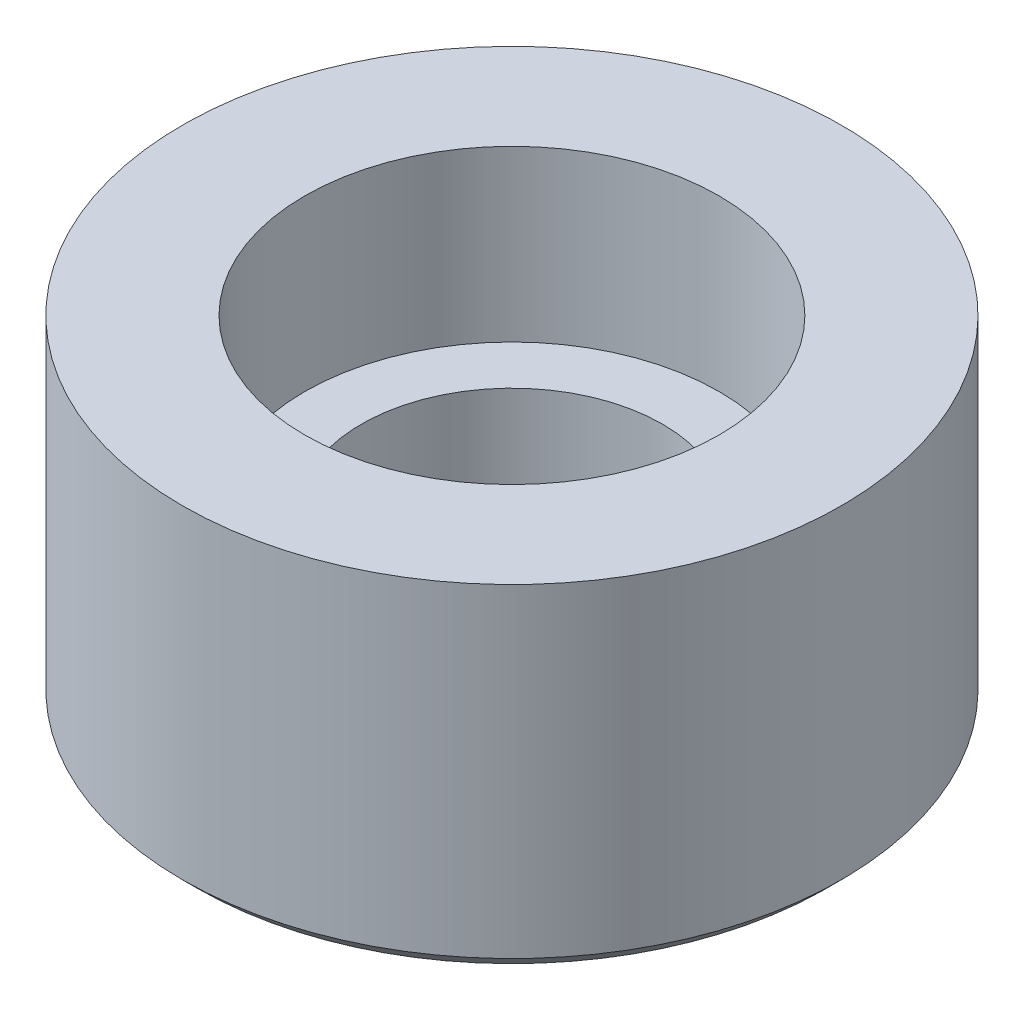
ISO-10303-21;
HEADER;
FILE_DESCRIPTION(('STEP AP214'),'2;1');
FILE_NAME('part.step','',(''),(''),'','','');
FILE_SCHEMA(('AUTOMOTIVE_DESIGN { 1 0 10303 214 1 1 1 1 }'));
ENDSEC;
DATA;
#1=APPLICATION_CONTEXT('core data for automotive mechanical design processes');
#2=APPLICATION_PROTOCOL_DEFINITION('international standard','automotive_design',2000,#1);
#3=PRODUCT_CONTEXT('',#1,'mechanical');
#4=PRODUCT('Part','Part','',(#3));
#5=PRODUCT_RELATED_PRODUCT_CATEGORY('part','',(#4));
#6=PRODUCT_DEFINITION_FORMATION('','',#4);
#7=PRODUCT_DEFINITION_CONTEXT('part definition',#1,'design');
#8=PRODUCT_DEFINITION('design','',#6,#7);
#9=PRODUCT_DEFINITION_SHAPE('','',#8);
#10=(LENGTH_UNIT() NAMED_UNIT(*) SI_UNIT(.MILLI.,.METRE.));
#11=(NAMED_UNIT(*) PLANE_ANGLE_UNIT() SI_UNIT($,.RADIAN.));
#12=(NAMED_UNIT(*) SI_UNIT($,.STERADIAN.) SOLID_ANGLE_UNIT());
#13=UNCERTAINTY_MEASURE_WITH_UNIT(LENGTH_MEASURE(1.E-05),#10,'distance_accuracy_value','');
#14=(GEOMETRIC_REPRESENTATION_CONTEXT(3) GLOBAL_UNCERTAINTY_ASSIGNED_CONTEXT((#13)) GLOBAL_UNIT_ASSIGNED_CONTEXT((#10,
#11,#12)) REPRESENTATION_CONTEXT('',''));
#15=CARTESIAN_POINT('',(0.,0.,0.));
#16=DIRECTION('',(0.,0.,1.));
#17=DIRECTION('',(1.,0.,0.));
#18=AXIS2_PLACEMENT_3D('',#15,#16,#17);
#19=CARTESIAN_POINT('',(0.,9.,0.));
#20=DIRECTION('',(0.,-1.,0.));
#21=DIRECTION('',(0.,0.,-1.));
#22=AXIS2_PLACEMENT_3D('',#19,#20,#21);
#23=CYLINDRICAL_SURFACE('',#22,4.);
#24=CARTESIAN_POINT('',(0.,0.,0.));
#25=DIRECTION('',(0.,1.,0.));
#26=DIRECTION('',(0.,0.,1.));
#27=AXIS2_PLACEMENT_3D('',#24,#25,#26);
#28=CIRCLE('',#27,4.);
#29=CARTESIAN_POINT('',(0.,0.,4.));
#30=VERTEX_POINT('',#29);
#31=EDGE_CURVE('E53',#30,#30,#28,.T.);
#32=ORIENTED_EDGE('',*,*,#31,.F.);
#33=EDGE_LOOP('',(#32));
#34=FACE_BOUND('',#33,.T.);
#35=CARTESIAN_POINT('',(0.,4.5,0.));
#36=DIRECTION('',(0.,1.,0.));
#37=DIRECTION('',(0.,0.,1.));
#38=AXIS2_PLACEMENT_3D('',#35,#36,#37);
#39=CIRCLE('',#38,4.);
#40=CARTESIAN_POINT('',(0.,4.5,4.));
#41=VERTEX_POINT('',#40);
#42=EDGE_CURVE('E59',#41,#41,#39,.T.);
#43=ORIENTED_EDGE('',*,*,#42,.T.);
#44=EDGE_LOOP('',(#43));
#45=FACE_BOUND('',#44,.T.);
#46=ADVANCED_FACE('F37',(#34,#45),#23,.F.);
#47=CARTESIAN_POINT('',(0.,9.,0.));
#48=DIRECTION('',(0.,1.,0.));
#49=DIRECTION('',(0.,0.,1.));
#50=AXIS2_PLACEMENT_3D('',#47,#48,#49);
#51=PLANE('',#50);
#52=CARTESIAN_POINT('',(0.,9.,0.));
#53=DIRECTION('',(0.,1.,0.));
#54=DIRECTION('',(0.,0.,1.));
#55=AXIS2_PLACEMENT_3D('',#52,#53,#54);
#56=CIRCLE('',#55,5.5);
#57=CARTESIAN_POINT('',(0.,9.,5.5));
#58=VERTEX_POINT('',#57);
#59=EDGE_CURVE('E56',#58,#58,#56,.T.);
#60=ORIENTED_EDGE('',*,*,#59,.F.);
#61=EDGE_LOOP('',(#60));
#62=FACE_BOUND('',#61,.T.);
#63=CARTESIAN_POINT('',(0.,9.,0.));
#64=DIRECTION('',(0.,1.,0.));
#65=DIRECTION('',(0.,0.,1.));
#66=AXIS2_PLACEMENT_3D('',#63,#64,#65);
#67=CIRCLE('',#66,8.75);
#68=CARTESIAN_POINT('',(0.,9.,8.75));
#69=VERTEX_POINT('',#68);
#70=EDGE_CURVE('E49',#69,#69,#67,.T.);
#71=ORIENTED_EDGE('',*,*,#70,.T.);
#72=EDGE_LOOP('',(#71));
#73=FACE_BOUND('',#72,.T.);
#74=ADVANCED_FACE('F84',(#62,#73),#51,.T.);
#75=CARTESIAN_POINT('',(0.,0.,0.));
#76=DIRECTION('',(0.,1.,0.));
#77=DIRECTION('',(0.,0.,1.));
#78=AXIS2_PLACEMENT_3D('',#75,#76,#77);
#79=PLANE('',#78);
#80=CARTESIAN_POINT('',(0.,0.,0.));
#81=DIRECTION('',(0.,1.,0.));
#82=DIRECTION('',(0.,0.,1.));
#83=AXIS2_PLACEMENT_3D('',#80,#81,#82);
#84=CIRCLE('',#83,8.35000000000001);
#85=CARTESIAN_POINT('',(0.,0.,8.35000000000001));
#86=VERTEX_POINT('',#85);
#87=EDGE_CURVE('E10',#86,#86,#84,.F.);
#88=ORIENTED_EDGE('',*,*,#87,.T.);
#89=EDGE_LOOP('',(#88));
#90=FACE_BOUND('',#89,.T.);
#91=ORIENTED_EDGE('',*,*,#31,.T.);
#92=EDGE_LOOP('',(#91));
#93=FACE_BOUND('',#92,.T.);
#94=ADVANCED_FACE('F81',(#90,#93),#79,.F.);
#95=CARTESIAN_POINT('',(0.,9.,0.));
#96=DIRECTION('',(0.,-1.,0.));
#97=DIRECTION('',(0.,0.,-1.));
#98=AXIS2_PLACEMENT_3D('',#95,#96,#97);
#99=CYLINDRICAL_SURFACE('',#98,8.75);
#100=CARTESIAN_POINT('',(0.,0.399999869282059,0.));
#101=DIRECTION('',(0.,1.,0.));
#102=DIRECTION('',(0.,0.,1.));
#103=AXIS2_PLACEMENT_3D('',#100,#101,#102);
#104=CIRCLE('',#103,8.75);
#105=CARTESIAN_POINT('',(0.,0.399999869282059,8.75));
#106=VERTEX_POINT('',#105);
#107=EDGE_CURVE('E45',#106,#106,#104,.T.);
#108=ORIENTED_EDGE('',*,*,#107,.T.);
#109=EDGE_LOOP('',(#108));
#110=FACE_BOUND('',#109,.T.);
#111=ORIENTED_EDGE('',*,*,#70,.F.);
#112=EDGE_LOOP('',(#111));
#113=FACE_BOUND('',#112,.T.);
#114=ADVANCED_FACE('F72',(#110,#113),#99,.T.);
#115=CARTESIAN_POINT('',(0.,4.5,0.));
#116=DIRECTION('',(0.,1.,0.));
#117=DIRECTION('',(0.,0.,1.));
#118=AXIS2_PLACEMENT_3D('',#115,#116,#117);
#119=CYLINDRICAL_SURFACE('',#118,5.5);
#120=ORIENTED_EDGE('',*,*,#59,.T.);
#121=EDGE_LOOP('',(#120));
#122=FACE_BOUND('',#121,.T.);
#123=CARTESIAN_POINT('',(0.,4.5,0.));
#124=DIRECTION('',(0.,1.,0.));
#125=DIRECTION('',(0.,0.,1.));
#126=AXIS2_PLACEMENT_3D('',#123,#124,#125);
#127=CIRCLE('',#126,5.5);
#128=CARTESIAN_POINT('',(0.,4.5,5.5));
#129=VERTEX_POINT('',#128);
#130=EDGE_CURVE('E61',#129,#129,#127,.T.);
#131=ORIENTED_EDGE('',*,*,#130,.F.);
#132=EDGE_LOOP('',(#131));
#133=FACE_BOUND('',#132,.T.);
#134=ADVANCED_FACE('F70',(#122,#133),#119,.F.);
#135=CARTESIAN_POINT('',(0.,4.5,0.));
#136=DIRECTION('',(0.,1.,0.));
#137=DIRECTION('',(0.,0.,1.));
#138=AXIS2_PLACEMENT_3D('',#135,#136,#137);
#139=PLANE('',#138);
#140=ORIENTED_EDGE('',*,*,#42,.F.);
#141=EDGE_LOOP('',(#140));
#142=FACE_BOUND('',#141,.T.);
#143=ORIENTED_EDGE('',*,*,#130,.T.);
#144=EDGE_LOOP('',(#143));
#145=FACE_BOUND('',#144,.T.);
#146=ADVANCED_FACE('F68',(#142,#145),#139,.T.);
#147=CARTESIAN_POINT('',(0.,0.399999869282059,0.));
#148=DIRECTION('',(0.,1.,0.));
#149=DIRECTION('',(0.,0.,1.));
#150=AXIS2_PLACEMENT_3D('',#147,#148,#149);
#151=CONICAL_SURFACE('',#150,8.75,0.785398326794896);
#152=ORIENTED_EDGE('',*,*,#87,.F.);
#153=EDGE_LOOP('',(#152));
#154=FACE_BOUND('',#153,.T.);
#155=ORIENTED_EDGE('',*,*,#107,.F.);
#156=EDGE_LOOP('',(#155));
#157=FACE_BOUND('',#156,.T.);
#158=ADVANCED_FACE('F40',(#154,#157),#151,.T.);
#159=CLOSED_SHELL('',(#46,#74,#94,#114,#134,#146,#158));
#160=MANIFOLD_SOLID_BREP('B2',#159);
#161=ADVANCED_BREP_SHAPE_REPRESENTATION('',(#18,#160),#14);
#162=SHAPE_DEFINITION_REPRESENTATION(#9,#161);
ENDSEC;
END-ISO-10303-21;
